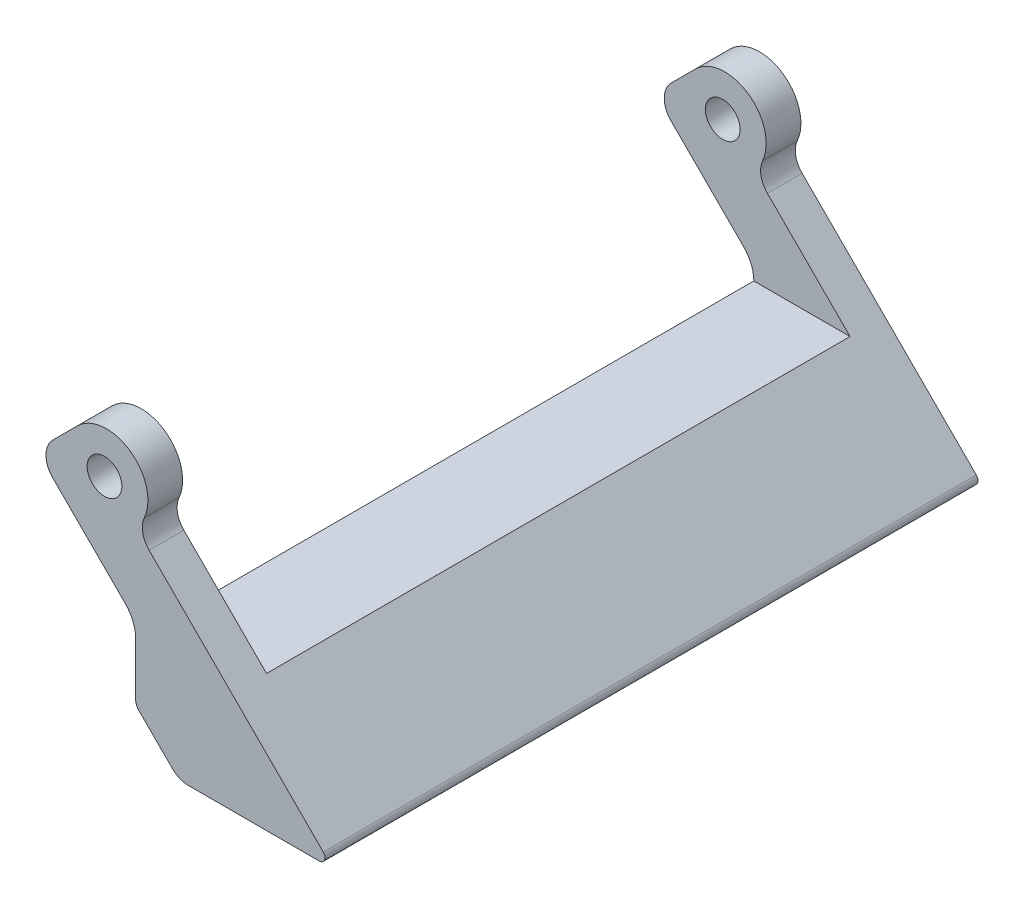
ISO-10303-21;
HEADER;
FILE_DESCRIPTION(('STEP AP214'),'2;1');
FILE_NAME('part.step','',(''),(''),'','','');
FILE_SCHEMA(('AUTOMOTIVE_DESIGN { 1 0 10303 214 1 1 1 1 }'));
ENDSEC;
DATA;
#1=APPLICATION_CONTEXT('core data for automotive mechanical design processes');
#2=APPLICATION_PROTOCOL_DEFINITION('international standard','automotive_design',2000,#1);
#3=PRODUCT_CONTEXT('',#1,'mechanical');
#4=PRODUCT('Part','Part','',(#3));
#5=PRODUCT_RELATED_PRODUCT_CATEGORY('part','',(#4));
#6=PRODUCT_DEFINITION_FORMATION('','',#4);
#7=PRODUCT_DEFINITION_CONTEXT('part definition',#1,'design');
#8=PRODUCT_DEFINITION('design','',#6,#7);
#9=PRODUCT_DEFINITION_SHAPE('','',#8);
#10=(LENGTH_UNIT() NAMED_UNIT(*) SI_UNIT(.MILLI.,.METRE.));
#11=(NAMED_UNIT(*) PLANE_ANGLE_UNIT() SI_UNIT($,.RADIAN.));
#12=(NAMED_UNIT(*) SI_UNIT($,.STERADIAN.) SOLID_ANGLE_UNIT());
#13=UNCERTAINTY_MEASURE_WITH_UNIT(LENGTH_MEASURE(1.E-05),#10,'distance_accuracy_value','');
#14=(GEOMETRIC_REPRESENTATION_CONTEXT(3) GLOBAL_UNCERTAINTY_ASSIGNED_CONTEXT((#13)) GLOBAL_UNIT_ASSIGNED_CONTEXT((#10,
#11,#12)) REPRESENTATION_CONTEXT('',''));
#15=CARTESIAN_POINT('',(0.,0.,0.));
#16=DIRECTION('',(0.,0.,1.));
#17=DIRECTION('',(1.,0.,0.));
#18=AXIS2_PLACEMENT_3D('',#15,#16,#17);
#19=CARTESIAN_POINT('',(0.,0.,3.));
#20=DIRECTION('',(0.,0.,1.));
#21=DIRECTION('',(1.,0.,0.));
#22=AXIS2_PLACEMENT_3D('',#19,#20,#21);
#23=PLANE('',#22);
#24=CARTESIAN_POINT('',(0.,0.,3.));
#25=DIRECTION('',(0.,0.,1.));
#26=DIRECTION('',(1.,0.,0.));
#27=AXIS2_PLACEMENT_3D('',#24,#25,#26);
#28=CIRCLE('',#27,1.5);
#29=CARTESIAN_POINT('',(1.5,0.,3.));
#30=VERTEX_POINT('',#29);
#31=EDGE_CURVE('E274',#30,#30,#28,.T.);
#32=ORIENTED_EDGE('',*,*,#31,.F.);
#33=EDGE_LOOP('',(#32));
#34=FACE_BOUND('',#33,.T.);
#35=CARTESIAN_POINT('',(-0.317797590198112,-10.7426406871192,3.));
#36=DIRECTION('',(0.,0.,1.));
#37=DIRECTION('',(1.,0.,0.));
#38=AXIS2_PLACEMENT_3D('',#35,#36,#37);
#39=CIRCLE('',#38,3.);
#40=CARTESIAN_POINT('',(1.80352275336153,-8.62132034355954,3.));
#41=VERTEX_POINT('',#40);
#42=CARTESIAN_POINT('',(2.68220240980189,-10.7426406871192,3.));
#43=VERTEX_POINT('',#42);
#44=EDGE_CURVE('E281',#41,#43,#39,.F.);
#45=ORIENTED_EDGE('',*,*,#44,.T.);
#46=DIRECTION('',(1.,0.,0.));
#47=VECTOR('',#46,1.);
#48=CARTESIAN_POINT('',(0.,-10.7426406871192,3.));
#49=LINE('',#48,#47);
#50=CARTESIAN_POINT('',(10.9959109087875,-10.7426406871192,3.));
#51=VERTEX_POINT('',#50);
#52=EDGE_CURVE('E184',#43,#51,#49,.T.);
#53=ORIENTED_EDGE('',*,*,#52,.T.);
#54=DIRECTION('',(0.707106781186544,-0.707106781186551,0.));
#55=VECTOR('',#54,1.);
#56=CARTESIAN_POINT('',(0.126635110834194,0.126635110834192,3.));
#57=LINE('',#56,#55);
#58=CARTESIAN_POINT('',(3.85415350269997,-3.60088328103162,3.));
#59=VERTEX_POINT('',#58);
#60=EDGE_CURVE('E283',#59,#51,#57,.T.);
#61=ORIENTED_EDGE('',*,*,#60,.F.);
#62=CARTESIAN_POINT('',(5.26836706507307,-2.18666971865853,3.));
#63=DIRECTION('',(0.,0.,1.));
#64=DIRECTION('',(1.,0.,0.));
#65=AXIS2_PLACEMENT_3D('',#62,#63,#64);
#66=CIRCLE('',#65,2.);
#67=CARTESIAN_POINT('',(3.4407480758895,-1.37438354348649,3.));
#68=VERTEX_POINT('',#67);
#69=EDGE_CURVE('E286',#68,#59,#66,.T.);
#70=ORIENTED_EDGE('',*,*,#69,.F.);
#71=CARTESIAN_POINT('',(0.177142738061685,0.0761274836064436,3.));
#72=DIRECTION('',(0.,0.,1.));
#73=DIRECTION('',(1.,0.,0.));
#74=AXIS2_PLACEMENT_3D('',#71,#72,#73);
#75=CIRCLE('',#74,3.57142857142859);
#76=CARTESIAN_POINT('',(-2.34823862331883,2.601508844987,3.));
#77=VERTEX_POINT('',#76);
#78=EDGE_CURVE('E289',#77,#68,#75,.F.);
#79=ORIENTED_EDGE('',*,*,#78,.F.);
#80=DIRECTION('',(-0.707106781186547,-0.707106781186548,0.));
#81=VECTOR('',#80,1.);
#82=CARTESIAN_POINT('',(-2.47487373415292,2.47487373415292,3.));
#83=LINE('',#82,#81);
#84=CARTESIAN_POINT('',(-4.46955896687851,0.480188501427322,3.));
#85=VERTEX_POINT('',#84);
#86=EDGE_CURVE('E292',#77,#85,#83,.T.);
#87=ORIENTED_EDGE('',*,*,#86,.T.);
#88=CARTESIAN_POINT('',(-3.05534540450542,-0.934025060945773,3.));
#89=DIRECTION('',(0.,0.,1.));
#90=DIRECTION('',(1.,0.,0.));
#91=AXIS2_PLACEMENT_3D('',#88,#89,#90);
#92=CIRCLE('',#91,2.);
#93=CARTESIAN_POINT('',(-4.46955896687851,-2.34823862331887,3.));
#94=VERTEX_POINT('',#93);
#95=EDGE_CURVE('E294',#85,#94,#92,.T.);
#96=ORIENTED_EDGE('',*,*,#95,.T.);
#97=DIRECTION('',(0.707106781186512,-0.707106781186583,0.));
#98=VECTOR('',#97,1.);
#99=CARTESIAN_POINT('',(-3.40889879509891,-3.40889879509857,3.));
#100=LINE('',#99,#98);
#101=EDGE_CURVE('E277',#94,#41,#100,.T.);
#102=ORIENTED_EDGE('',*,*,#101,.T.);
#103=EDGE_LOOP('',(#45,#53,#61,#70,#79,#87,#96,#102));
#104=FACE_BOUND('',#103,.T.);
#105=ADVANCED_FACE('F35',(#34,#104),#23,.T.);
#106=CARTESIAN_POINT('',(-3.40889879509891,-3.40889879509857,3.));
#107=DIRECTION('',(0.707106781186583,0.707106781186512,0.));
#108=DIRECTION('',(-0.707106781186512,0.707106781186583,0.));
#109=AXIS2_PLACEMENT_3D('',#106,#107,#108);
#110=PLANE('',#109);
#111=DIRECTION('',(0.707106781186512,-0.707106781186583,0.));
#112=VECTOR('',#111,1.);
#113=CARTESIAN_POINT('',(-3.40889879509891,-3.40889879509857,0.));
#114=LINE('',#113,#112);
#115=CARTESIAN_POINT('',(-4.46955896687851,-2.34823862331887,0.));
#116=VERTEX_POINT('',#115);
#117=CARTESIAN_POINT('',(1.80352275336153,-8.62132034355954,0.));
#118=VERTEX_POINT('',#117);
#119=EDGE_CURVE('E299',#116,#118,#114,.T.);
#120=ORIENTED_EDGE('',*,*,#119,.T.);
#121=DIRECTION('',(0.,0.,-1.));
#122=VECTOR('',#121,1.);
#123=CARTESIAN_POINT('',(1.80352275336153,-8.62132034355954,3.));
#124=LINE('',#123,#122);
#125=EDGE_CURVE('E341',#41,#118,#124,.T.);
#126=ORIENTED_EDGE('',*,*,#125,.F.);
#127=ORIENTED_EDGE('',*,*,#101,.F.);
#128=DIRECTION('',(0.,0.,-1.));
#129=VECTOR('',#128,1.);
#130=CARTESIAN_POINT('',(-4.46955896687851,-2.34823862331887,3.));
#131=LINE('',#130,#129);
#132=EDGE_CURVE('E296',#94,#116,#131,.T.);
#133=ORIENTED_EDGE('',*,*,#132,.T.);
#134=EDGE_LOOP('',(#120,#126,#127,#133));
#135=FACE_BOUND('',#134,.T.);
#136=ADVANCED_FACE('F393',(#135),#110,.F.);
#137=CARTESIAN_POINT('',(-0.317797590198112,-10.7426406871192,3.));
#138=DIRECTION('',(0.,0.,-1.));
#139=DIRECTION('',(-1.,0.,0.));
#140=AXIS2_PLACEMENT_3D('',#137,#138,#139);
#141=CYLINDRICAL_SURFACE('',#140,3.);
#142=CARTESIAN_POINT('',(-0.317797590198112,-10.7426406871192,0.));
#143=DIRECTION('',(0.,0.,1.));
#144=DIRECTION('',(1.,0.,0.));
#145=AXIS2_PLACEMENT_3D('',#142,#143,#144);
#146=CIRCLE('',#145,3.);
#147=CARTESIAN_POINT('',(2.68220240980189,-10.7426406871192,0.));
#148=VERTEX_POINT('',#147);
#149=EDGE_CURVE('E302',#118,#148,#146,.F.);
#150=ORIENTED_EDGE('',*,*,#149,.T.);
#151=DIRECTION('',(0.,0.,-1.));
#152=VECTOR('',#151,1.);
#153=CARTESIAN_POINT('',(2.68220240980189,-10.7426406871192,3.));
#154=LINE('',#153,#152);
#155=EDGE_CURVE('E339',#43,#148,#154,.T.);
#156=ORIENTED_EDGE('',*,*,#155,.F.);
#157=ORIENTED_EDGE('',*,*,#44,.F.);
#158=ORIENTED_EDGE('',*,*,#125,.T.);
#159=EDGE_LOOP('',(#150,#156,#157,#158));
#160=FACE_BOUND('',#159,.T.);
#161=ADVANCED_FACE('F399',(#160),#141,.F.);
#162=CARTESIAN_POINT('',(2.68220240980189,0.,3.));
#163=DIRECTION('',(1.,0.,0.));
#164=DIRECTION('',(0.,0.,-1.));
#165=AXIS2_PLACEMENT_3D('',#162,#163,#164);
#166=PLANE('',#165);
#167=DIRECTION('',(0.,-1.,0.));
#168=VECTOR('',#167,1.);
#169=CARTESIAN_POINT('',(2.68220240980189,0.,0.));
#170=LINE('',#169,#168);
#171=CARTESIAN_POINT('',(2.68220240980189,-15.3284271247452,0.));
#172=VERTEX_POINT('',#171);
#173=EDGE_CURVE('E304',#148,#172,#170,.T.);
#174=ORIENTED_EDGE('',*,*,#173,.T.);
#175=DIRECTION('',(0.,0.,-1.));
#176=VECTOR('',#175,1.);
#177=CARTESIAN_POINT('',(2.68220240980189,-15.3284271247452,3.));
#178=LINE('',#177,#176);
#179=CARTESIAN_POINT('',(2.68220240980189,-15.3284271247452,56.4));
#180=VERTEX_POINT('',#179);
#181=EDGE_CURVE('E43',#172,#180,#178,.F.);
#182=ORIENTED_EDGE('',*,*,#181,.T.);
#183=DIRECTION('',(0.,-1.,0.));
#184=VECTOR('',#183,1.);
#185=CARTESIAN_POINT('',(2.68220240980189,0.,56.4));
#186=LINE('',#185,#184);
#187=CARTESIAN_POINT('',(2.68220240980189,-10.7426406871192,56.4));
#188=VERTEX_POINT('',#187);
#189=EDGE_CURVE('E193',#188,#180,#186,.T.);
#190=ORIENTED_EDGE('',*,*,#189,.F.);
#191=DIRECTION('',(0.,0.,1.));
#192=VECTOR('',#191,1.);
#193=CARTESIAN_POINT('',(2.68220240980189,-10.7426406871192,53.4));
#194=LINE('',#193,#192);
#195=CARTESIAN_POINT('',(2.68220240980189,-10.7426406871192,53.4));
#196=VERTEX_POINT('',#195);
#197=EDGE_CURVE('E191',#196,#188,#194,.T.);
#198=ORIENTED_EDGE('',*,*,#197,.F.);
#199=DIRECTION('',(0.,0.,-1.));
#200=VECTOR('',#199,1.);
#201=CARTESIAN_POINT('',(2.68220240980189,-10.7426406871192,28.2));
#202=LINE('',#201,#200);
#203=EDGE_CURVE('E177',#196,#43,#202,.T.);
#204=ORIENTED_EDGE('',*,*,#203,.T.);
#205=ORIENTED_EDGE('',*,*,#155,.T.);
#206=EDGE_LOOP('',(#174,#182,#190,#198,#204,#205));
#207=FACE_BOUND('',#206,.T.);
#208=ADVANCED_FACE('F192',(#207),#166,.F.);
#209=CARTESIAN_POINT('',(0.,-19.5,3.));
#210=DIRECTION('',(0.,1.,0.));
#211=DIRECTION('',(-1.,0.,0.));
#212=AXIS2_PLACEMENT_3D('',#209,#210,#211);
#213=PLANE('',#212);
#214=DIRECTION('',(1.,0.,0.));
#215=VECTOR('',#214,1.);
#216=CARTESIAN_POINT('',(0.,-19.5,56.4));
#217=LINE('',#216,#215);
#218=CARTESIAN_POINT('',(7.26798884742978,-19.5,56.4));
#219=VERTEX_POINT('',#218);
#220=CARTESIAN_POINT('',(18.5461634404815,-19.5,56.4));
#221=VERTEX_POINT('',#220);
#222=EDGE_CURVE('E241',#219,#221,#217,.T.);
#223=ORIENTED_EDGE('',*,*,#222,.F.);
#224=DIRECTION('',(0.,0.,-1.));
#225=VECTOR('',#224,1.);
#226=CARTESIAN_POINT('',(7.26798884742978,-19.5,3.));
#227=LINE('',#226,#225);
#228=CARTESIAN_POINT('',(7.26798884742978,-19.5,0.));
#229=VERTEX_POINT('',#228);
#230=EDGE_CURVE('E346',#219,#229,#227,.T.);
#231=ORIENTED_EDGE('',*,*,#230,.T.);
#232=DIRECTION('',(1.,0.,0.));
#233=VECTOR('',#232,1.);
#234=CARTESIAN_POINT('',(0.,-19.5,0.));
#235=LINE('',#234,#233);
#236=CARTESIAN_POINT('',(18.5461634404815,-19.5,0.));
#237=VERTEX_POINT('',#236);
#238=EDGE_CURVE('E306',#229,#237,#235,.T.);
#239=ORIENTED_EDGE('',*,*,#238,.T.);
#240=DIRECTION('',(0.,0.,-1.));
#241=VECTOR('',#240,1.);
#242=CARTESIAN_POINT('',(18.5461634404815,-19.5,3.));
#243=LINE('',#242,#241);
#244=EDGE_CURVE('E336',#221,#237,#243,.T.);
#245=ORIENTED_EDGE('',*,*,#244,.F.);
#246=EDGE_LOOP('',(#223,#231,#239,#245));
#247=FACE_BOUND('',#246,.T.);
#248=ADVANCED_FACE('F433',(#247),#213,.F.);
#249=CARTESIAN_POINT('',(18.5461634404809,-19.,3.));
#250=DIRECTION('',(0.,0.,-1.));
#251=DIRECTION('',(-1.,0.,0.));
#252=AXIS2_PLACEMENT_3D('',#249,#250,#251);
#253=CYLINDRICAL_SURFACE('',#252,0.500000000000284);
#254=CARTESIAN_POINT('',(18.5461634404809,-19.,0.));
#255=DIRECTION('',(0.,0.,1.));
#256=DIRECTION('',(1.,0.,0.));
#257=AXIS2_PLACEMENT_3D('',#254,#255,#256);
#258=CIRCLE('',#257,0.500000000000284);
#259=CARTESIAN_POINT('',(18.8997168310746,-18.6464466094064,0.));
#260=VERTEX_POINT('',#259);
#261=EDGE_CURVE('E308',#237,#260,#258,.T.);
#262=ORIENTED_EDGE('',*,*,#261,.T.);
#263=DIRECTION('',(0.,0.,-1.));
#264=VECTOR('',#263,1.);
#265=CARTESIAN_POINT('',(18.8997168310746,-18.6464466094064,3.));
#266=LINE('',#265,#264);
#267=CARTESIAN_POINT('',(18.8997168310746,-18.6464466094064,56.4));
#268=VERTEX_POINT('',#267);
#269=EDGE_CURVE('E334',#268,#260,#266,.T.);
#270=ORIENTED_EDGE('',*,*,#269,.F.);
#271=CARTESIAN_POINT('',(18.5461634404809,-19.,56.4));
#272=DIRECTION('',(0.,0.,1.));
#273=DIRECTION('',(1.,0.,0.));
#274=AXIS2_PLACEMENT_3D('',#271,#272,#273);
#275=CIRCLE('',#274,0.500000000000284);
#276=EDGE_CURVE('E243',#221,#268,#275,.T.);
#277=ORIENTED_EDGE('',*,*,#276,.F.);
#278=ORIENTED_EDGE('',*,*,#244,.T.);
#279=EDGE_LOOP('',(#262,#270,#277,#278));
#280=FACE_BOUND('',#279,.T.);
#281=ADVANCED_FACE('F429',(#280),#253,.T.);
#282=CARTESIAN_POINT('',(0.126635110834194,0.126635110834192,3.));
#283=DIRECTION('',(0.707106781186551,0.707106781186544,0.));
#284=DIRECTION('',(-0.707106781186544,0.707106781186551,0.));
#285=AXIS2_PLACEMENT_3D('',#282,#283,#284);
#286=PLANE('',#285);
#287=DIRECTION('',(0.707106781186544,-0.707106781186551,0.));
#288=VECTOR('',#287,1.);
#289=CARTESIAN_POINT('',(0.126635110834194,0.126635110834192,0.));
#290=LINE('',#289,#288);
#291=CARTESIAN_POINT('',(3.85415350269997,-3.60088328103162,0.));
#292=VERTEX_POINT('',#291);
#293=EDGE_CURVE('E311',#292,#260,#290,.T.);
#294=ORIENTED_EDGE('',*,*,#293,.F.);
#295=DIRECTION('',(0.,0.,-1.));
#296=VECTOR('',#295,1.);
#297=CARTESIAN_POINT('',(3.85415350269997,-3.60088328103162,3.));
#298=LINE('',#297,#296);
#299=EDGE_CURVE('E332',#59,#292,#298,.T.);
#300=ORIENTED_EDGE('',*,*,#299,.F.);
#301=ORIENTED_EDGE('',*,*,#60,.T.);
#302=DIRECTION('',(0.,0.,-1.));
#303=VECTOR('',#302,1.);
#304=CARTESIAN_POINT('',(10.9959109087875,-10.7426406871192,28.2));
#305=LINE('',#304,#303);
#306=CARTESIAN_POINT('',(10.9959109087875,-10.7426406871192,53.4));
#307=VERTEX_POINT('',#306);
#308=EDGE_CURVE('E188',#307,#51,#305,.T.);
#309=ORIENTED_EDGE('',*,*,#308,.F.);
#310=DIRECTION('',(0.707106781186544,-0.707106781186551,0.));
#311=VECTOR('',#310,1.);
#312=CARTESIAN_POINT('',(0.126635110834194,0.126635110834192,53.4));
#313=LINE('',#312,#311);
#314=CARTESIAN_POINT('',(3.85415350269997,-3.60088328103162,53.4));
#315=VERTEX_POINT('',#314);
#316=EDGE_CURVE('E207',#315,#307,#313,.T.);
#317=ORIENTED_EDGE('',*,*,#316,.F.);
#318=DIRECTION('',(0.,0.,1.));
#319=VECTOR('',#318,1.);
#320=CARTESIAN_POINT('',(3.85415350269997,-3.60088328103162,53.4));
#321=LINE('',#320,#319);
#322=CARTESIAN_POINT('',(3.85415350269997,-3.60088328103162,56.4));
#323=VERTEX_POINT('',#322);
#324=EDGE_CURVE('E198',#315,#323,#321,.T.);
#325=ORIENTED_EDGE('',*,*,#324,.T.);
#326=DIRECTION('',(0.707106781186544,-0.707106781186551,0.));
#327=VECTOR('',#326,1.);
#328=CARTESIAN_POINT('',(0.126635110834194,0.126635110834192,56.4));
#329=LINE('',#328,#327);
#330=EDGE_CURVE('E246',#323,#268,#329,.T.);
#331=ORIENTED_EDGE('',*,*,#330,.T.);
#332=ORIENTED_EDGE('',*,*,#269,.T.);
#333=EDGE_LOOP('',(#294,#300,#301,#309,#317,#325,#331,#332));
#334=FACE_BOUND('',#333,.T.);
#335=ADVANCED_FACE('F425',(#334),#286,.T.);
#336=CARTESIAN_POINT('',(5.26836706507307,-2.18666971865853,3.));
#337=DIRECTION('',(0.,0.,-1.));
#338=DIRECTION('',(-1.,0.,0.));
#339=AXIS2_PLACEMENT_3D('',#336,#337,#338);
#340=CYLINDRICAL_SURFACE('',#339,2.);
#341=CARTESIAN_POINT('',(5.26836706507307,-2.18666971865853,0.));
#342=DIRECTION('',(0.,0.,1.));
#343=DIRECTION('',(1.,0.,0.));
#344=AXIS2_PLACEMENT_3D('',#341,#342,#343);
#345=CIRCLE('',#344,2.);
#346=CARTESIAN_POINT('',(3.4407480758895,-1.37438354348649,0.));
#347=VERTEX_POINT('',#346);
#348=EDGE_CURVE('E314',#347,#292,#345,.T.);
#349=ORIENTED_EDGE('',*,*,#348,.F.);
#350=DIRECTION('',(0.,0.,-1.));
#351=VECTOR('',#350,1.);
#352=CARTESIAN_POINT('',(3.4407480758895,-1.37438354348649,3.));
#353=LINE('',#352,#351);
#354=EDGE_CURVE('E330',#68,#347,#353,.T.);
#355=ORIENTED_EDGE('',*,*,#354,.F.);
#356=ORIENTED_EDGE('',*,*,#69,.T.);
#357=ORIENTED_EDGE('',*,*,#299,.T.);
#358=EDGE_LOOP('',(#349,#355,#356,#357));
#359=FACE_BOUND('',#358,.T.);
#360=ADVANCED_FACE('F421',(#359),#340,.F.);
#361=CARTESIAN_POINT('',(0.177142738061685,0.0761274836064436,3.));
#362=DIRECTION('',(0.,0.,-1.));
#363=DIRECTION('',(-1.,0.,0.));
#364=AXIS2_PLACEMENT_3D('',#361,#362,#363);
#365=CYLINDRICAL_SURFACE('',#364,3.57142857142859);
#366=CARTESIAN_POINT('',(0.177142738061685,0.0761274836064436,0.));
#367=DIRECTION('',(0.,0.,1.));
#368=DIRECTION('',(1.,0.,0.));
#369=AXIS2_PLACEMENT_3D('',#366,#367,#368);
#370=CIRCLE('',#369,3.57142857142859);
#371=CARTESIAN_POINT('',(-2.34823862331883,2.601508844987,0.));
#372=VERTEX_POINT('',#371);
#373=EDGE_CURVE('E317',#372,#347,#370,.F.);
#374=ORIENTED_EDGE('',*,*,#373,.F.);
#375=DIRECTION('',(0.,0.,-1.));
#376=VECTOR('',#375,1.);
#377=CARTESIAN_POINT('',(-2.34823862331883,2.601508844987,3.));
#378=LINE('',#377,#376);
#379=EDGE_CURVE('E328',#77,#372,#378,.T.);
#380=ORIENTED_EDGE('',*,*,#379,.F.);
#381=ORIENTED_EDGE('',*,*,#78,.T.);
#382=ORIENTED_EDGE('',*,*,#354,.T.);
#383=EDGE_LOOP('',(#374,#380,#381,#382));
#384=FACE_BOUND('',#383,.T.);
#385=ADVANCED_FACE('F417',(#384),#365,.T.);
#386=CARTESIAN_POINT('',(-2.47487373415292,2.47487373415292,3.));
#387=DIRECTION('',(0.707106781186548,-0.707106781186547,0.));
#388=DIRECTION('',(0.707106781186547,0.707106781186548,0.));
#389=AXIS2_PLACEMENT_3D('',#386,#387,#388);
#390=PLANE('',#389);
#391=DIRECTION('',(-0.707106781186547,-0.707106781186548,0.));
#392=VECTOR('',#391,1.);
#393=CARTESIAN_POINT('',(-2.47487373415292,2.47487373415292,0.));
#394=LINE('',#393,#392);
#395=CARTESIAN_POINT('',(-4.46955896687851,0.480188501427322,0.));
#396=VERTEX_POINT('',#395);
#397=EDGE_CURVE('E320',#372,#396,#394,.T.);
#398=ORIENTED_EDGE('',*,*,#397,.T.);
#399=DIRECTION('',(0.,0.,-1.));
#400=VECTOR('',#399,1.);
#401=CARTESIAN_POINT('',(-4.46955896687851,0.480188501427322,3.));
#402=LINE('',#401,#400);
#403=EDGE_CURVE('E325',#85,#396,#402,.T.);
#404=ORIENTED_EDGE('',*,*,#403,.F.);
#405=ORIENTED_EDGE('',*,*,#86,.F.);
#406=ORIENTED_EDGE('',*,*,#379,.T.);
#407=EDGE_LOOP('',(#398,#404,#405,#406));
#408=FACE_BOUND('',#407,.T.);
#409=ADVANCED_FACE('F414',(#408),#390,.F.);
#410=CARTESIAN_POINT('',(0.,0.,3.));
#411=DIRECTION('',(0.,0.,-1.));
#412=DIRECTION('',(-1.,0.,0.));
#413=AXIS2_PLACEMENT_3D('',#410,#411,#412);
#414=CYLINDRICAL_SURFACE('',#413,1.5);
#415=ORIENTED_EDGE('',*,*,#31,.T.);
#416=EDGE_LOOP('',(#415));
#417=FACE_BOUND('',#416,.T.);
#418=CARTESIAN_POINT('',(0.,0.,0.));
#419=DIRECTION('',(0.,0.,1.));
#420=DIRECTION('',(1.,0.,0.));
#421=AXIS2_PLACEMENT_3D('',#418,#419,#420);
#422=CIRCLE('',#421,1.5);
#423=CARTESIAN_POINT('',(1.5,0.,0.));
#424=VERTEX_POINT('',#423);
#425=EDGE_CURVE('E187',#424,#424,#422,.T.);
#426=ORIENTED_EDGE('',*,*,#425,.F.);
#427=EDGE_LOOP('',(#426));
#428=FACE_BOUND('',#427,.T.);
#429=ADVANCED_FACE('F412',(#417,#428),#414,.F.);
#430=CARTESIAN_POINT('',(-3.05534540450542,-0.934025060945773,3.));
#431=DIRECTION('',(0.,0.,-1.));
#432=DIRECTION('',(-1.,0.,0.));
#433=AXIS2_PLACEMENT_3D('',#430,#431,#432);
#434=CYLINDRICAL_SURFACE('',#433,2.);
#435=CARTESIAN_POINT('',(-3.05534540450542,-0.934025060945773,0.));
#436=DIRECTION('',(0.,0.,1.));
#437=DIRECTION('',(1.,0.,0.));
#438=AXIS2_PLACEMENT_3D('',#435,#436,#437);
#439=CIRCLE('',#438,2.);
#440=EDGE_CURVE('E278',#396,#116,#439,.T.);
#441=ORIENTED_EDGE('',*,*,#440,.T.);
#442=ORIENTED_EDGE('',*,*,#132,.F.);
#443=ORIENTED_EDGE('',*,*,#95,.F.);
#444=ORIENTED_EDGE('',*,*,#403,.T.);
#445=EDGE_LOOP('',(#441,#442,#443,#444));
#446=FACE_BOUND('',#445,.T.);
#447=ADVANCED_FACE('F408',(#446),#434,.T.);
#448=CARTESIAN_POINT('',(0.,0.,0.));
#449=DIRECTION('',(0.,0.,1.));
#450=DIRECTION('',(1.,0.,0.));
#451=AXIS2_PLACEMENT_3D('',#448,#449,#450);
#452=PLANE('',#451);
#453=ORIENTED_EDGE('',*,*,#425,.T.);
#454=EDGE_LOOP('',(#453));
#455=FACE_BOUND('',#454,.T.);
#456=DIRECTION('',(-0.707106781186546,0.707106781186549,0.));
#457=VECTOR('',#456,1.);
#458=CARTESIAN_POINT('',(-6.5302191386582,-6.53021913865818,0.));
#459=LINE('',#458,#457);
#460=CARTESIAN_POINT('',(5.85377528505668,-18.9142135623731,0.));
#461=VERTEX_POINT('',#460);
#462=CARTESIAN_POINT('',(2.97509562861534,-16.0355339059317,0.));
#463=VERTEX_POINT('',#462);
#464=EDGE_CURVE('E209',#461,#463,#459,.T.);
#465=ORIENTED_EDGE('',*,*,#464,.T.);
#466=CARTESIAN_POINT('',(3.68220240980189,-15.3284271247452,0.));
#467=DIRECTION('',(0.,0.,1.));
#468=DIRECTION('',(1.,0.,0.));
#469=AXIS2_PLACEMENT_3D('',#466,#467,#468);
#470=CIRCLE('',#469,1.);
#471=EDGE_CURVE('E57',#463,#172,#470,.F.);
#472=ORIENTED_EDGE('',*,*,#471,.T.);
#473=ORIENTED_EDGE('',*,*,#173,.F.);
#474=ORIENTED_EDGE('',*,*,#149,.F.);
#475=ORIENTED_EDGE('',*,*,#119,.F.);
#476=ORIENTED_EDGE('',*,*,#440,.F.);
#477=ORIENTED_EDGE('',*,*,#397,.F.);
#478=ORIENTED_EDGE('',*,*,#373,.T.);
#479=ORIENTED_EDGE('',*,*,#348,.T.);
#480=ORIENTED_EDGE('',*,*,#293,.T.);
#481=ORIENTED_EDGE('',*,*,#261,.F.);
#482=ORIENTED_EDGE('',*,*,#238,.F.);
#483=CARTESIAN_POINT('',(7.26798884742978,-17.5,0.));
#484=DIRECTION('',(0.,0.,1.));
#485=DIRECTION('',(1.,0.,0.));
#486=AXIS2_PLACEMENT_3D('',#483,#484,#485);
#487=CIRCLE('',#486,2.);
#488=EDGE_CURVE('E349',#229,#461,#487,.F.);
#489=ORIENTED_EDGE('',*,*,#488,.T.);
#490=EDGE_LOOP('',(#465,#472,#473,#474,#475,#476,#477,#478,#479,#480,#481,#482,#489));
#491=FACE_BOUND('',#490,.T.);
#492=ADVANCED_FACE('F367',(#455,#491),#452,.F.);
#493=CARTESIAN_POINT('',(0.,-10.7426406871192,28.2));
#494=DIRECTION('',(0.,1.,0.));
#495=DIRECTION('',(0.,0.,1.));
#496=AXIS2_PLACEMENT_3D('',#493,#494,#495);
#497=PLANE('',#496);
#498=ORIENTED_EDGE('',*,*,#52,.F.);
#499=ORIENTED_EDGE('',*,*,#203,.F.);
#500=DIRECTION('',(1.,0.,0.));
#501=VECTOR('',#500,1.);
#502=CARTESIAN_POINT('',(0.,-10.7426406871192,53.4));
#503=LINE('',#502,#501);
#504=EDGE_CURVE('E181',#196,#307,#503,.T.);
#505=ORIENTED_EDGE('',*,*,#504,.T.);
#506=ORIENTED_EDGE('',*,*,#308,.T.);
#507=EDGE_LOOP('',(#498,#499,#505,#506));
#508=FACE_BOUND('',#507,.T.);
#509=ADVANCED_FACE('F179',(#508),#497,.T.);
#510=CARTESIAN_POINT('',(0.,0.,53.4));
#511=DIRECTION('',(0.,0.,-1.));
#512=DIRECTION('',(1.,0.,0.));
#513=AXIS2_PLACEMENT_3D('',#510,#511,#512);
#514=PLANE('',#513);
#515=CARTESIAN_POINT('',(0.,0.,53.4));
#516=DIRECTION('',(0.,0.,1.));
#517=DIRECTION('',(1.,0.,0.));
#518=AXIS2_PLACEMENT_3D('',#515,#516,#517);
#519=CIRCLE('',#518,1.5);
#520=CARTESIAN_POINT('',(1.5,0.,53.4));
#521=VERTEX_POINT('',#520);
#522=EDGE_CURVE('E218',#521,#521,#519,.T.);
#523=ORIENTED_EDGE('',*,*,#522,.T.);
#524=EDGE_LOOP('',(#523));
#525=FACE_BOUND('',#524,.T.);
#526=CARTESIAN_POINT('',(-0.317797590198112,-10.7426406871192,53.4));
#527=DIRECTION('',(0.,0.,1.));
#528=DIRECTION('',(1.,0.,0.));
#529=AXIS2_PLACEMENT_3D('',#526,#527,#528);
#530=CIRCLE('',#529,3.);
#531=CARTESIAN_POINT('',(1.80352275336153,-8.62132034355954,53.4));
#532=VERTEX_POINT('',#531);
#533=EDGE_CURVE('E204',#532,#196,#530,.F.);
#534=ORIENTED_EDGE('',*,*,#533,.F.);
#535=DIRECTION('',(0.707106781186512,-0.707106781186583,0.));
#536=VECTOR('',#535,1.);
#537=CARTESIAN_POINT('',(-3.40889879509891,-3.40889879509857,53.4));
#538=LINE('',#537,#536);
#539=CARTESIAN_POINT('',(-4.46955896687851,-2.34823862331887,53.4));
#540=VERTEX_POINT('',#539);
#541=EDGE_CURVE('E214',#540,#532,#538,.T.);
#542=ORIENTED_EDGE('',*,*,#541,.F.);
#543=CARTESIAN_POINT('',(-3.05534540450542,-0.934025060945773,53.4));
#544=DIRECTION('',(0.,0.,1.));
#545=DIRECTION('',(1.,0.,0.));
#546=AXIS2_PLACEMENT_3D('',#543,#544,#545);
#547=CIRCLE('',#546,2.);
#548=CARTESIAN_POINT('',(-4.46955896687851,0.480188501427322,53.4));
#549=VERTEX_POINT('',#548);
#550=EDGE_CURVE('E229',#549,#540,#547,.T.);
#551=ORIENTED_EDGE('',*,*,#550,.F.);
#552=DIRECTION('',(-0.707106781186547,-0.707106781186548,0.));
#553=VECTOR('',#552,1.);
#554=CARTESIAN_POINT('',(-2.47487373415292,2.47487373415292,53.4));
#555=LINE('',#554,#553);
#556=CARTESIAN_POINT('',(-2.34823862331883,2.601508844987,53.4));
#557=VERTEX_POINT('',#556);
#558=EDGE_CURVE('E226',#557,#549,#555,.T.);
#559=ORIENTED_EDGE('',*,*,#558,.F.);
#560=CARTESIAN_POINT('',(0.177142738061685,0.0761274836064436,53.4));
#561=DIRECTION('',(0.,0.,1.));
#562=DIRECTION('',(1.,0.,0.));
#563=AXIS2_PLACEMENT_3D('',#560,#561,#562);
#564=CIRCLE('',#563,3.57142857142859);
#565=CARTESIAN_POINT('',(3.4407480758895,-1.37438354348649,53.4));
#566=VERTEX_POINT('',#565);
#567=EDGE_CURVE('E223',#557,#566,#564,.F.);
#568=ORIENTED_EDGE('',*,*,#567,.T.);
#569=CARTESIAN_POINT('',(5.26836706507307,-2.18666971865853,53.4));
#570=DIRECTION('',(0.,0.,1.));
#571=DIRECTION('',(1.,0.,0.));
#572=AXIS2_PLACEMENT_3D('',#569,#570,#571);
#573=CIRCLE('',#572,2.);
#574=EDGE_CURVE('E216',#566,#315,#573,.T.);
#575=ORIENTED_EDGE('',*,*,#574,.T.);
#576=ORIENTED_EDGE('',*,*,#316,.T.);
#577=ORIENTED_EDGE('',*,*,#504,.F.);
#578=EDGE_LOOP('',(#534,#542,#551,#559,#568,#575,#576,#577));
#579=FACE_BOUND('',#578,.T.);
#580=ADVANCED_FACE('F202',(#525,#579),#514,.T.);
#581=CARTESIAN_POINT('',(-3.40889879509891,-3.40889879509857,53.4));
#582=DIRECTION('',(0.707106781186583,0.707106781186512,0.));
#583=DIRECTION('',(-0.707106781186512,0.707106781186583,0.));
#584=AXIS2_PLACEMENT_3D('',#581,#582,#583);
#585=PLANE('',#584);
#586=DIRECTION('',(0.707106781186512,-0.707106781186583,0.));
#587=VECTOR('',#586,1.);
#588=CARTESIAN_POINT('',(-3.40889879509891,-3.40889879509857,56.4));
#589=LINE('',#588,#587);
#590=CARTESIAN_POINT('',(-4.46955896687851,-2.34823862331887,56.4));
#591=VERTEX_POINT('',#590);
#592=CARTESIAN_POINT('',(1.80352275336153,-8.62132034355954,56.4));
#593=VERTEX_POINT('',#592);
#594=EDGE_CURVE('E235',#591,#593,#589,.T.);
#595=ORIENTED_EDGE('',*,*,#594,.F.);
#596=DIRECTION('',(0.,0.,1.));
#597=VECTOR('',#596,1.);
#598=CARTESIAN_POINT('',(-4.46955896687851,-2.34823862331887,53.4));
#599=LINE('',#598,#597);
#600=EDGE_CURVE('E232',#540,#591,#599,.T.);
#601=ORIENTED_EDGE('',*,*,#600,.F.);
#602=ORIENTED_EDGE('',*,*,#541,.T.);
#603=DIRECTION('',(0.,0.,1.));
#604=VECTOR('',#603,1.);
#605=CARTESIAN_POINT('',(1.80352275336153,-8.62132034355954,53.4));
#606=LINE('',#605,#604);
#607=EDGE_CURVE('E197',#532,#593,#606,.T.);
#608=ORIENTED_EDGE('',*,*,#607,.T.);
#609=EDGE_LOOP('',(#595,#601,#602,#608));
#610=FACE_BOUND('',#609,.T.);
#611=ADVANCED_FACE('F473',(#610),#585,.F.);
#612=CARTESIAN_POINT('',(-0.317797590198112,-10.7426406871192,53.4));
#613=DIRECTION('',(0.,0.,1.));
#614=DIRECTION('',(-1.,0.,0.));
#615=AXIS2_PLACEMENT_3D('',#612,#613,#614);
#616=CYLINDRICAL_SURFACE('',#615,3.);
#617=CARTESIAN_POINT('',(-0.317797590198112,-10.7426406871192,56.4));
#618=DIRECTION('',(0.,0.,1.));
#619=DIRECTION('',(1.,0.,0.));
#620=AXIS2_PLACEMENT_3D('',#617,#618,#619);
#621=CIRCLE('',#620,3.);
#622=EDGE_CURVE('E238',#593,#188,#621,.F.);
#623=ORIENTED_EDGE('',*,*,#622,.F.);
#624=ORIENTED_EDGE('',*,*,#607,.F.);
#625=ORIENTED_EDGE('',*,*,#533,.T.);
#626=ORIENTED_EDGE('',*,*,#197,.T.);
#627=EDGE_LOOP('',(#623,#624,#625,#626));
#628=FACE_BOUND('',#627,.T.);
#629=ADVANCED_FACE('F211',(#628),#616,.F.);
#630=CARTESIAN_POINT('',(5.26836706507307,-2.18666971865853,53.4));
#631=DIRECTION('',(0.,0.,1.));
#632=DIRECTION('',(-1.,0.,0.));
#633=AXIS2_PLACEMENT_3D('',#630,#631,#632);
#634=CYLINDRICAL_SURFACE('',#633,2.);
#635=CARTESIAN_POINT('',(5.26836706507307,-2.18666971865853,56.4));
#636=DIRECTION('',(0.,0.,1.));
#637=DIRECTION('',(1.,0.,0.));
#638=AXIS2_PLACEMENT_3D('',#635,#636,#637);
#639=CIRCLE('',#638,2.);
#640=CARTESIAN_POINT('',(3.4407480758895,-1.37438354348649,56.4));
#641=VERTEX_POINT('',#640);
#642=EDGE_CURVE('E249',#641,#323,#639,.T.);
#643=ORIENTED_EDGE('',*,*,#642,.T.);
#644=ORIENTED_EDGE('',*,*,#324,.F.);
#645=ORIENTED_EDGE('',*,*,#574,.F.);
#646=DIRECTION('',(0.,0.,1.));
#647=VECTOR('',#646,1.);
#648=CARTESIAN_POINT('',(3.4407480758895,-1.37438354348649,53.4));
#649=LINE('',#648,#647);
#650=EDGE_CURVE('E266',#566,#641,#649,.T.);
#651=ORIENTED_EDGE('',*,*,#650,.T.);
#652=EDGE_LOOP('',(#643,#644,#645,#651));
#653=FACE_BOUND('',#652,.T.);
#654=ADVANCED_FACE('F487',(#653),#634,.F.);
#655=CARTESIAN_POINT('',(0.177142738061685,0.0761274836064436,53.4));
#656=DIRECTION('',(0.,0.,1.));
#657=DIRECTION('',(-1.,0.,0.));
#658=AXIS2_PLACEMENT_3D('',#655,#656,#657);
#659=CYLINDRICAL_SURFACE('',#658,3.57142857142859);
#660=CARTESIAN_POINT('',(0.177142738061685,0.0761274836064436,56.4));
#661=DIRECTION('',(0.,0.,1.));
#662=DIRECTION('',(1.,0.,0.));
#663=AXIS2_PLACEMENT_3D('',#660,#661,#662);
#664=CIRCLE('',#663,3.57142857142859);
#665=CARTESIAN_POINT('',(-2.34823862331883,2.601508844987,56.4));
#666=VERTEX_POINT('',#665);
#667=EDGE_CURVE('E251',#666,#641,#664,.F.);
#668=ORIENTED_EDGE('',*,*,#667,.T.);
#669=ORIENTED_EDGE('',*,*,#650,.F.);
#670=ORIENTED_EDGE('',*,*,#567,.F.);
#671=DIRECTION('',(0.,0.,1.));
#672=VECTOR('',#671,1.);
#673=CARTESIAN_POINT('',(-2.34823862331883,2.601508844987,53.4));
#674=LINE('',#673,#672);
#675=EDGE_CURVE('E263',#557,#666,#674,.T.);
#676=ORIENTED_EDGE('',*,*,#675,.T.);
#677=EDGE_LOOP('',(#668,#669,#670,#676));
#678=FACE_BOUND('',#677,.T.);
#679=ADVANCED_FACE('F494',(#678),#659,.T.);
#680=CARTESIAN_POINT('',(-2.47487373415292,2.47487373415292,53.4));
#681=DIRECTION('',(0.707106781186548,-0.707106781186547,0.));
#682=DIRECTION('',(0.707106781186547,0.707106781186548,0.));
#683=AXIS2_PLACEMENT_3D('',#680,#681,#682);
#684=PLANE('',#683);
#685=DIRECTION('',(-0.707106781186547,-0.707106781186548,0.));
#686=VECTOR('',#685,1.);
#687=CARTESIAN_POINT('',(-2.47487373415292,2.47487373415292,56.4));
#688=LINE('',#687,#686);
#689=CARTESIAN_POINT('',(-4.46955896687851,0.480188501427322,56.4));
#690=VERTEX_POINT('',#689);
#691=EDGE_CURVE('E253',#666,#690,#688,.T.);
#692=ORIENTED_EDGE('',*,*,#691,.F.);
#693=ORIENTED_EDGE('',*,*,#675,.F.);
#694=ORIENTED_EDGE('',*,*,#558,.T.);
#695=DIRECTION('',(0.,0.,1.));
#696=VECTOR('',#695,1.);
#697=CARTESIAN_POINT('',(-4.46955896687851,0.480188501427322,53.4));
#698=LINE('',#697,#696);
#699=EDGE_CURVE('E260',#549,#690,#698,.T.);
#700=ORIENTED_EDGE('',*,*,#699,.T.);
#701=EDGE_LOOP('',(#692,#693,#694,#700));
#702=FACE_BOUND('',#701,.T.);
#703=ADVANCED_FACE('F378',(#702),#684,.F.);
#704=CARTESIAN_POINT('',(0.,0.,53.4));
#705=DIRECTION('',(0.,0.,1.));
#706=DIRECTION('',(-1.,0.,0.));
#707=AXIS2_PLACEMENT_3D('',#704,#705,#706);
#708=CYLINDRICAL_SURFACE('',#707,1.5);
#709=ORIENTED_EDGE('',*,*,#522,.F.);
#710=EDGE_LOOP('',(#709));
#711=FACE_BOUND('',#710,.T.);
#712=CARTESIAN_POINT('',(0.,0.,56.4));
#713=DIRECTION('',(0.,0.,1.));
#714=DIRECTION('',(1.,0.,0.));
#715=AXIS2_PLACEMENT_3D('',#712,#713,#714);
#716=CIRCLE('',#715,1.5);
#717=CARTESIAN_POINT('',(1.5,0.,56.4));
#718=VERTEX_POINT('',#717);
#719=EDGE_CURVE('E208',#718,#718,#716,.T.);
#720=ORIENTED_EDGE('',*,*,#719,.T.);
#721=EDGE_LOOP('',(#720));
#722=FACE_BOUND('',#721,.T.);
#723=ADVANCED_FACE('F374',(#711,#722),#708,.F.);
#724=CARTESIAN_POINT('',(-3.05534540450542,-0.934025060945773,53.4));
#725=DIRECTION('',(0.,0.,1.));
#726=DIRECTION('',(-1.,0.,0.));
#727=AXIS2_PLACEMENT_3D('',#724,#725,#726);
#728=CYLINDRICAL_SURFACE('',#727,2.);
#729=CARTESIAN_POINT('',(-3.05534540450542,-0.934025060945773,56.4));
#730=DIRECTION('',(0.,0.,1.));
#731=DIRECTION('',(1.,0.,0.));
#732=AXIS2_PLACEMENT_3D('',#729,#730,#731);
#733=CIRCLE('',#732,2.);
#734=EDGE_CURVE('E256',#690,#591,#733,.T.);
#735=ORIENTED_EDGE('',*,*,#734,.F.);
#736=ORIENTED_EDGE('',*,*,#699,.F.);
#737=ORIENTED_EDGE('',*,*,#550,.T.);
#738=ORIENTED_EDGE('',*,*,#600,.T.);
#739=EDGE_LOOP('',(#735,#736,#737,#738));
#740=FACE_BOUND('',#739,.T.);
#741=ADVANCED_FACE('F377',(#740),#728,.T.);
#742=CARTESIAN_POINT('',(0.,0.,56.4));
#743=DIRECTION('',(0.,0.,-1.));
#744=DIRECTION('',(1.,0.,0.));
#745=AXIS2_PLACEMENT_3D('',#742,#743,#744);
#746=PLANE('',#745);
#747=ORIENTED_EDGE('',*,*,#719,.F.);
#748=EDGE_LOOP('',(#747));
#749=FACE_BOUND('',#748,.T.);
#750=ORIENTED_EDGE('',*,*,#189,.T.);
#751=CARTESIAN_POINT('',(3.68220240980189,-15.3284271247452,56.4));
#752=DIRECTION('',(0.,0.,-1.));
#753=DIRECTION('',(-1.,0.,0.));
#754=AXIS2_PLACEMENT_3D('',#751,#752,#753);
#755=CIRCLE('',#754,1.);
#756=CARTESIAN_POINT('',(2.97509562861534,-16.0355339059317,56.4));
#757=VERTEX_POINT('',#756);
#758=EDGE_CURVE('E11',#180,#757,#755,.F.);
#759=ORIENTED_EDGE('',*,*,#758,.T.);
#760=DIRECTION('',(0.707106781186546,-0.707106781186549,0.));
#761=VECTOR('',#760,1.);
#762=CARTESIAN_POINT('',(-6.5302191386582,-6.53021913865818,56.4));
#763=LINE('',#762,#761);
#764=CARTESIAN_POINT('',(5.85377528505668,-18.9142135623731,56.4));
#765=VERTEX_POINT('',#764);
#766=EDGE_CURVE('E344',#757,#765,#763,.T.);
#767=ORIENTED_EDGE('',*,*,#766,.T.);
#768=CARTESIAN_POINT('',(7.26798884742978,-17.5,56.4));
#769=DIRECTION('',(0.,0.,-1.));
#770=DIRECTION('',(-1.,0.,0.));
#771=AXIS2_PLACEMENT_3D('',#768,#769,#770);
#772=CIRCLE('',#771,2.);
#773=EDGE_CURVE('E354',#765,#219,#772,.F.);
#774=ORIENTED_EDGE('',*,*,#773,.T.);
#775=ORIENTED_EDGE('',*,*,#222,.T.);
#776=ORIENTED_EDGE('',*,*,#276,.T.);
#777=ORIENTED_EDGE('',*,*,#330,.F.);
#778=ORIENTED_EDGE('',*,*,#642,.F.);
#779=ORIENTED_EDGE('',*,*,#667,.F.);
#780=ORIENTED_EDGE('',*,*,#691,.T.);
#781=ORIENTED_EDGE('',*,*,#734,.T.);
#782=ORIENTED_EDGE('',*,*,#594,.T.);
#783=ORIENTED_EDGE('',*,*,#622,.T.);
#784=EDGE_LOOP('',(#750,#759,#767,#774,#775,#776,#777,#778,#779,#780,#781,#782,#783));
#785=FACE_BOUND('',#784,.T.);
#786=ADVANCED_FACE('F382',(#749,#785),#746,.F.);
#787=CARTESIAN_POINT('',(-6.5302191386582,-6.53021913865818,0.));
#788=DIRECTION('',(0.707106781186549,0.707106781186546,0.));
#789=DIRECTION('',(-0.707106781186546,0.707106781186549,0.));
#790=AXIS2_PLACEMENT_3D('',#787,#788,#789);
#791=PLANE('',#790);
#792=ORIENTED_EDGE('',*,*,#766,.F.);
#793=DIRECTION('',(0.,0.,-1.));
#794=VECTOR('',#793,1.);
#795=CARTESIAN_POINT('',(2.97509562861534,-16.0355339059317,0.));
#796=LINE('',#795,#794);
#797=EDGE_CURVE('E356',#757,#463,#796,.T.);
#798=ORIENTED_EDGE('',*,*,#797,.T.);
#799=ORIENTED_EDGE('',*,*,#464,.F.);
#800=DIRECTION('',(0.,0.,-1.));
#801=VECTOR('',#800,1.);
#802=CARTESIAN_POINT('',(5.85377528505668,-18.9142135623731,0.));
#803=LINE('',#802,#801);
#804=EDGE_CURVE('E351',#461,#765,#803,.F.);
#805=ORIENTED_EDGE('',*,*,#804,.T.);
#806=EDGE_LOOP('',(#792,#798,#799,#805));
#807=FACE_BOUND('',#806,.T.);
#808=ADVANCED_FACE('F363',(#807),#791,.F.);
#809=CARTESIAN_POINT('',(7.26798884742978,-17.5,3.));
#810=DIRECTION('',(0.,0.,-1.));
#811=DIRECTION('',(-1.,0.,0.));
#812=AXIS2_PLACEMENT_3D('',#809,#810,#811);
#813=CYLINDRICAL_SURFACE('',#812,2.);
#814=ORIENTED_EDGE('',*,*,#773,.F.);
#815=ORIENTED_EDGE('',*,*,#804,.F.);
#816=ORIENTED_EDGE('',*,*,#488,.F.);
#817=ORIENTED_EDGE('',*,*,#230,.F.);
#818=EDGE_LOOP('',(#814,#815,#816,#817));
#819=FACE_BOUND('',#818,.T.);
#820=ADVANCED_FACE('F387',(#819),#813,.T.);
#821=CARTESIAN_POINT('',(3.68220240980189,-15.3284271247452,0.));
#822=DIRECTION('',(0.,0.,-1.));
#823=DIRECTION('',(-1.,0.,0.));
#824=AXIS2_PLACEMENT_3D('',#821,#822,#823);
#825=CYLINDRICAL_SURFACE('',#824,1.);
#826=ORIENTED_EDGE('',*,*,#758,.F.);
#827=ORIENTED_EDGE('',*,*,#181,.F.);
#828=ORIENTED_EDGE('',*,*,#471,.F.);
#829=ORIENTED_EDGE('',*,*,#797,.F.);
#830=EDGE_LOOP('',(#826,#827,#828,#829));
#831=FACE_BOUND('',#830,.T.);
#832=ADVANCED_FACE('F37',(#831),#825,.T.);
#833=CLOSED_SHELL('',(#105,#136,#161,#208,#248,#281,#335,#360,#385,#409,#429,#447,#492,#509,
#580,#611,#629,#654,#679,#703,#723,#741,#786,#808,#820,#832));
#834=MANIFOLD_SOLID_BREP('B2',#833);
#835=ADVANCED_BREP_SHAPE_REPRESENTATION('',(#18,#834),#14);
#836=SHAPE_DEFINITION_REPRESENTATION(#9,#835);
ENDSEC;
END-ISO-10303-21;
